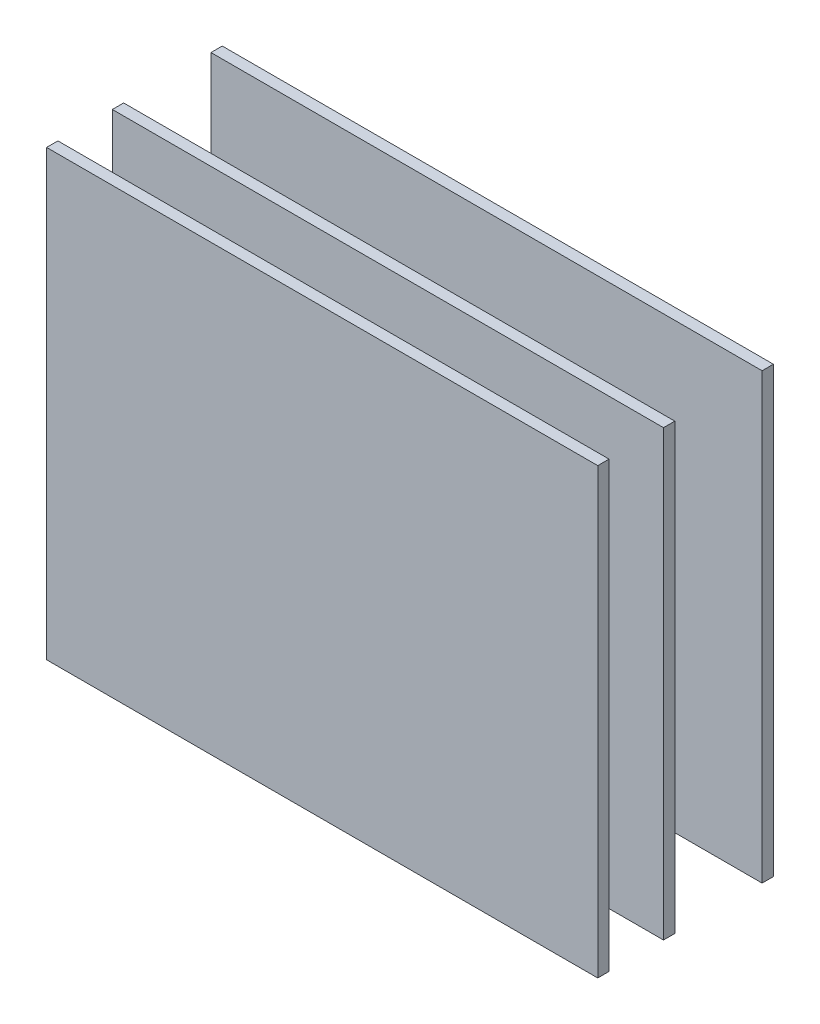
ISO-10303-21;
HEADER;
FILE_DESCRIPTION(('STEP AP214'),'2;1');
FILE_NAME('part.step','',(''),(''),'','','');
FILE_SCHEMA(('AUTOMOTIVE_DESIGN { 1 0 10303 214 1 1 1 1 }'));
ENDSEC;
DATA;
#1=APPLICATION_CONTEXT('core data for automotive mechanical design processes');
#2=APPLICATION_PROTOCOL_DEFINITION('international standard','automotive_design',2000,#1);
#3=PRODUCT_CONTEXT('',#1,'mechanical');
#4=PRODUCT('Part','Part','',(#3));
#5=PRODUCT_RELATED_PRODUCT_CATEGORY('part','',(#4));
#6=PRODUCT_DEFINITION_FORMATION('','',#4);
#7=PRODUCT_DEFINITION_CONTEXT('part definition',#1,'design');
#8=PRODUCT_DEFINITION('design','',#6,#7);
#9=PRODUCT_DEFINITION_SHAPE('','',#8);
#10=(LENGTH_UNIT() NAMED_UNIT(*) SI_UNIT(.MILLI.,.METRE.));
#11=(NAMED_UNIT(*) PLANE_ANGLE_UNIT() SI_UNIT($,.RADIAN.));
#12=(NAMED_UNIT(*) SI_UNIT($,.STERADIAN.) SOLID_ANGLE_UNIT());
#13=UNCERTAINTY_MEASURE_WITH_UNIT(LENGTH_MEASURE(1.E-05),#10,'distance_accuracy_value','');
#14=(GEOMETRIC_REPRESENTATION_CONTEXT(3) GLOBAL_UNCERTAINTY_ASSIGNED_CONTEXT((#13)) GLOBAL_UNIT_ASSIGNED_CONTEXT((#10,
#11,#12)) REPRESENTATION_CONTEXT('',''));
#15=CARTESIAN_POINT('',(0.,0.,0.));
#16=DIRECTION('',(0.,0.,1.));
#17=DIRECTION('',(1.,0.,0.));
#18=AXIS2_PLACEMENT_3D('',#15,#16,#17);
#19=CARTESIAN_POINT('',(0.838391795984,0.675,0.607810488195));
#20=DIRECTION('',(0.,0.,-1.));
#21=DIRECTION('',(-1.,0.,0.));
#22=AXIS2_PLACEMENT_3D('',#19,#20,#21);
#23=PLANE('',#22);
#24=DIRECTION('',(1.,0.,0.));
#25=VECTOR('',#24,1.);
#26=CARTESIAN_POINT('',(-1.05,-0.675,0.607810488195));
#27=LINE('',#26,#25);
#28=CARTESIAN_POINT('',(-0.838391795984,-0.675,0.607810488195));
#29=VERTEX_POINT('',#28);
#30=CARTESIAN_POINT('',(0.838391795984,-0.675,0.607810488195));
#31=VERTEX_POINT('',#30);
#32=EDGE_CURVE('P0_E68',#29,#31,#27,.T.);
#33=ORIENTED_EDGE('',*,*,#32,.F.);
#34=DIRECTION('',(0.,1.,0.));
#35=VECTOR('',#34,1.);
#36=CARTESIAN_POINT('',(-0.838391795984,0.675,0.607810488195));
#37=LINE('',#36,#35);
#38=CARTESIAN_POINT('',(-0.838391795984,0.675,0.607810488195));
#39=VERTEX_POINT('',#38);
#40=EDGE_CURVE('P0_E55',#39,#29,#37,.F.);
#41=ORIENTED_EDGE('',*,*,#40,.F.);
#42=DIRECTION('',(1.,0.,0.));
#43=VECTOR('',#42,1.);
#44=CARTESIAN_POINT('',(1.05,0.675,0.607810488195));
#45=LINE('',#44,#43);
#46=CARTESIAN_POINT('',(0.838391795984,0.675,0.607810488195));
#47=VERTEX_POINT('',#46);
#48=EDGE_CURVE('P0_E20',#47,#39,#45,.F.);
#49=ORIENTED_EDGE('',*,*,#48,.F.);
#50=DIRECTION('',(0.,1.,0.));
#51=VECTOR('',#50,1.);
#52=CARTESIAN_POINT('',(0.838391795984,0.675,0.607810488195));
#53=LINE('',#52,#51);
#54=EDGE_CURVE('P0_E81',#31,#47,#53,.T.);
#55=ORIENTED_EDGE('',*,*,#54,.F.);
#56=EDGE_LOOP('',(#33,#41,#49,#55));
#57=FACE_BOUND('',#56,.T.);
#58=ADVANCED_FACE('P0_F17',(#57),#23,.T.);
#59=CARTESIAN_POINT('',(1.05,0.675,0.));
#60=DIRECTION('',(0.,1.,0.));
#61=DIRECTION('',(0.,0.,1.));
#62=AXIS2_PLACEMENT_3D('',#59,#60,#61);
#63=PLANE('',#62);
#64=DIRECTION('',(0.,0.,1.));
#65=VECTOR('',#64,1.);
#66=CARTESIAN_POINT('',(-0.838391795984,0.675,0.607810488195));
#67=LINE('',#66,#65);
#68=CARTESIAN_POINT('',(-0.838391795984,0.675,0.642189511805));
#69=VERTEX_POINT('',#68);
#70=EDGE_CURVE('P0_E61',#69,#39,#67,.F.);
#71=ORIENTED_EDGE('',*,*,#70,.F.);
#72=DIRECTION('',(1.,0.,0.));
#73=VECTOR('',#72,1.);
#74=CARTESIAN_POINT('',(-0.838391795984,0.675,0.642189511805));
#75=LINE('',#74,#73);
#76=CARTESIAN_POINT('',(0.838391795984,0.675,0.642189511805));
#77=VERTEX_POINT('',#76);
#78=EDGE_CURVE('P0_E83',#77,#69,#75,.F.);
#79=ORIENTED_EDGE('',*,*,#78,.F.);
#80=DIRECTION('',(0.,0.,-1.));
#81=VECTOR('',#80,1.);
#82=CARTESIAN_POINT('',(0.838391795984,0.675,0.642189511805));
#83=LINE('',#82,#81);
#84=EDGE_CURVE('P0_E64',#47,#77,#83,.F.);
#85=ORIENTED_EDGE('',*,*,#84,.F.);
#86=ORIENTED_EDGE('',*,*,#48,.T.);
#87=EDGE_LOOP('',(#71,#79,#85,#86));
#88=FACE_BOUND('',#87,.T.);
#89=ADVANCED_FACE('P0_F60',(#88),#63,.T.);
#90=CARTESIAN_POINT('',(-0.838391795984,0.675,0.607810488195));
#91=DIRECTION('',(-1.,0.,0.));
#92=DIRECTION('',(0.,0.,1.));
#93=AXIS2_PLACEMENT_3D('',#90,#91,#92);
#94=PLANE('',#93);
#95=DIRECTION('',(0.,0.,-1.));
#96=VECTOR('',#95,1.);
#97=CARTESIAN_POINT('',(-0.838391795984,-0.675,0.));
#98=LINE('',#97,#96);
#99=CARTESIAN_POINT('',(-0.838391795984,-0.675,0.642189511805));
#100=VERTEX_POINT('',#99);
#101=EDGE_CURVE('P0_E70',#100,#29,#98,.T.);
#102=ORIENTED_EDGE('',*,*,#101,.F.);
#103=DIRECTION('',(0.,1.,0.));
#104=VECTOR('',#103,1.);
#105=CARTESIAN_POINT('',(-0.838391795984,0.675,0.642189511805));
#106=LINE('',#105,#104);
#107=EDGE_CURVE('P0_E74',#69,#100,#106,.F.);
#108=ORIENTED_EDGE('',*,*,#107,.F.);
#109=ORIENTED_EDGE('',*,*,#70,.T.);
#110=ORIENTED_EDGE('',*,*,#40,.T.);
#111=EDGE_LOOP('',(#102,#108,#109,#110));
#112=FACE_BOUND('',#111,.T.);
#113=ADVANCED_FACE('P0_F72',(#112),#94,.T.);
#114=CARTESIAN_POINT('',(-1.05,-0.675,0.));
#115=DIRECTION('',(0.,-1.,0.));
#116=DIRECTION('',(0.,0.,-1.));
#117=AXIS2_PLACEMENT_3D('',#114,#115,#116);
#118=PLANE('',#117);
#119=ORIENTED_EDGE('',*,*,#101,.T.);
#120=ORIENTED_EDGE('',*,*,#32,.T.);
#121=DIRECTION('',(0.,0.,-1.));
#122=VECTOR('',#121,1.);
#123=CARTESIAN_POINT('',(0.838391795984,-0.675,0.642189511805));
#124=LINE('',#123,#122);
#125=CARTESIAN_POINT('',(0.838391795984,-0.675,0.642189511805));
#126=VERTEX_POINT('',#125);
#127=EDGE_CURVE('P0_E35',#126,#31,#124,.T.);
#128=ORIENTED_EDGE('',*,*,#127,.F.);
#129=DIRECTION('',(1.,0.,0.));
#130=VECTOR('',#129,1.);
#131=CARTESIAN_POINT('',(-0.838391795984,-0.675,0.642189511805));
#132=LINE('',#131,#130);
#133=EDGE_CURVE('P0_E26',#100,#126,#132,.T.);
#134=ORIENTED_EDGE('',*,*,#133,.F.);
#135=EDGE_LOOP('',(#119,#120,#128,#134));
#136=FACE_BOUND('',#135,.T.);
#137=ADVANCED_FACE('P0_F89',(#136),#118,.T.);
#138=CARTESIAN_POINT('',(0.838391795984,0.675,0.642189511805));
#139=DIRECTION('',(1.,0.,0.));
#140=DIRECTION('',(0.,0.,-1.));
#141=AXIS2_PLACEMENT_3D('',#138,#139,#140);
#142=PLANE('',#141);
#143=ORIENTED_EDGE('',*,*,#127,.T.);
#144=ORIENTED_EDGE('',*,*,#54,.T.);
#145=ORIENTED_EDGE('',*,*,#84,.T.);
#146=DIRECTION('',(0.,1.,0.));
#147=VECTOR('',#146,1.);
#148=CARTESIAN_POINT('',(0.838391795984,0.675,0.642189511805));
#149=LINE('',#148,#147);
#150=EDGE_CURVE('P0_E11',#126,#77,#149,.T.);
#151=ORIENTED_EDGE('',*,*,#150,.F.);
#152=EDGE_LOOP('',(#143,#144,#145,#151));
#153=FACE_BOUND('',#152,.T.);
#154=ADVANCED_FACE('P0_F91',(#153),#142,.T.);
#155=CARTESIAN_POINT('',(-0.838391795984,0.675,0.642189511805));
#156=DIRECTION('',(0.,0.,1.));
#157=DIRECTION('',(1.,0.,0.));
#158=AXIS2_PLACEMENT_3D('',#155,#156,#157);
#159=PLANE('',#158);
#160=ORIENTED_EDGE('',*,*,#133,.T.);
#161=ORIENTED_EDGE('',*,*,#150,.T.);
#162=ORIENTED_EDGE('',*,*,#78,.T.);
#163=ORIENTED_EDGE('',*,*,#107,.T.);
#164=EDGE_LOOP('',(#160,#161,#162,#163));
#165=FACE_BOUND('',#164,.T.);
#166=ADVANCED_FACE('P0_F88',(#165),#159,.T.);
#167=CLOSED_SHELL('',(#58,#89,#113,#137,#154,#166));
#168=MANIFOLD_SOLID_BREP('P0_B1',#167);
#169=CARTESIAN_POINT('',(-0.838391795984,0.675,0.342189511805));
#170=DIRECTION('',(0.,0.,1.));
#171=DIRECTION('',(1.,0.,0.));
#172=AXIS2_PLACEMENT_3D('',#169,#170,#171);
#173=PLANE('',#172);
#174=DIRECTION('',(1.,0.,0.));
#175=VECTOR('',#174,1.);
#176=CARTESIAN_POINT('',(-1.05,-0.675,0.342189511805));
#177=LINE('',#176,#175);
#178=CARTESIAN_POINT('',(0.838391795984,-0.675,0.342189511805));
#179=VERTEX_POINT('',#178);
#180=CARTESIAN_POINT('',(-0.838391795984,-0.675,0.342189511805));
#181=VERTEX_POINT('',#180);
#182=EDGE_CURVE('P1_E68',#179,#181,#177,.F.);
#183=ORIENTED_EDGE('',*,*,#182,.F.);
#184=DIRECTION('',(0.,1.,0.));
#185=VECTOR('',#184,1.);
#186=CARTESIAN_POINT('',(0.838391795984,0.675,0.342189511805));
#187=LINE('',#186,#185);
#188=CARTESIAN_POINT('',(0.838391795984,0.675,0.342189511805));
#189=VERTEX_POINT('',#188);
#190=EDGE_CURVE('P1_E55',#189,#179,#187,.F.);
#191=ORIENTED_EDGE('',*,*,#190,.F.);
#192=DIRECTION('',(1.,0.,0.));
#193=VECTOR('',#192,1.);
#194=CARTESIAN_POINT('',(1.05,0.675,0.342189511805));
#195=LINE('',#194,#193);
#196=CARTESIAN_POINT('',(-0.838391795984,0.675,0.342189511805));
#197=VERTEX_POINT('',#196);
#198=EDGE_CURVE('P1_E20',#197,#189,#195,.T.);
#199=ORIENTED_EDGE('',*,*,#198,.F.);
#200=DIRECTION('',(0.,1.,0.));
#201=VECTOR('',#200,1.);
#202=CARTESIAN_POINT('',(-0.838391795984,0.675,0.342189511805));
#203=LINE('',#202,#201);
#204=EDGE_CURVE('P1_E81',#181,#197,#203,.T.);
#205=ORIENTED_EDGE('',*,*,#204,.F.);
#206=EDGE_LOOP('',(#183,#191,#199,#205));
#207=FACE_BOUND('',#206,.T.);
#208=ADVANCED_FACE('P1_F17',(#207),#173,.T.);
#209=CARTESIAN_POINT('',(1.05,0.675,0.));
#210=DIRECTION('',(0.,1.,0.));
#211=DIRECTION('',(0.,0.,1.));
#212=AXIS2_PLACEMENT_3D('',#209,#210,#211);
#213=PLANE('',#212);
#214=DIRECTION('',(0.,0.,1.));
#215=VECTOR('',#214,1.);
#216=CARTESIAN_POINT('',(-0.838391795984,0.675,0.307810488195));
#217=LINE('',#216,#215);
#218=CARTESIAN_POINT('',(-0.838391795984,0.675,0.307810488195));
#219=VERTEX_POINT('',#218);
#220=EDGE_CURVE('P1_E64',#197,#219,#217,.F.);
#221=ORIENTED_EDGE('',*,*,#220,.F.);
#222=ORIENTED_EDGE('',*,*,#198,.T.);
#223=DIRECTION('',(0.,0.,-1.));
#224=VECTOR('',#223,1.);
#225=CARTESIAN_POINT('',(0.838391795984,0.675,0.342189511805));
#226=LINE('',#225,#224);
#227=CARTESIAN_POINT('',(0.838391795984,0.675,0.307810488195));
#228=VERTEX_POINT('',#227);
#229=EDGE_CURVE('P1_E61',#228,#189,#226,.F.);
#230=ORIENTED_EDGE('',*,*,#229,.F.);
#231=DIRECTION('',(-1.,0.,0.));
#232=VECTOR('',#231,1.);
#233=CARTESIAN_POINT('',(0.838391795984,0.675,0.307810488195));
#234=LINE('',#233,#232);
#235=EDGE_CURVE('P1_E83',#219,#228,#234,.F.);
#236=ORIENTED_EDGE('',*,*,#235,.F.);
#237=EDGE_LOOP('',(#221,#222,#230,#236));
#238=FACE_BOUND('',#237,.T.);
#239=ADVANCED_FACE('P1_F60',(#238),#213,.T.);
#240=CARTESIAN_POINT('',(0.838391795984,0.675,0.342189511805));
#241=DIRECTION('',(1.,0.,0.));
#242=DIRECTION('',(0.,0.,-1.));
#243=AXIS2_PLACEMENT_3D('',#240,#241,#242);
#244=PLANE('',#243);
#245=DIRECTION('',(0.,0.,-1.));
#246=VECTOR('',#245,1.);
#247=CARTESIAN_POINT('',(0.838391795984,-0.675,0.));
#248=LINE('',#247,#246);
#249=CARTESIAN_POINT('',(0.838391795984,-0.675,0.307810488195));
#250=VERTEX_POINT('',#249);
#251=EDGE_CURVE('P1_E70',#250,#179,#248,.F.);
#252=ORIENTED_EDGE('',*,*,#251,.F.);
#253=DIRECTION('',(0.,1.,0.));
#254=VECTOR('',#253,1.);
#255=CARTESIAN_POINT('',(0.838391795984,0.675,0.307810488195));
#256=LINE('',#255,#254);
#257=EDGE_CURVE('P1_E74',#228,#250,#256,.F.);
#258=ORIENTED_EDGE('',*,*,#257,.F.);
#259=ORIENTED_EDGE('',*,*,#229,.T.);
#260=ORIENTED_EDGE('',*,*,#190,.T.);
#261=EDGE_LOOP('',(#252,#258,#259,#260));
#262=FACE_BOUND('',#261,.T.);
#263=ADVANCED_FACE('P1_F72',(#262),#244,.T.);
#264=CARTESIAN_POINT('',(-1.05,-0.675,0.));
#265=DIRECTION('',(0.,-1.,0.));
#266=DIRECTION('',(0.,0.,-1.));
#267=AXIS2_PLACEMENT_3D('',#264,#265,#266);
#268=PLANE('',#267);
#269=DIRECTION('',(0.,0.,1.));
#270=VECTOR('',#269,1.);
#271=CARTESIAN_POINT('',(-0.838391795984,-0.675,0.307810488195));
#272=LINE('',#271,#270);
#273=CARTESIAN_POINT('',(-0.838391795984,-0.675,0.307810488195));
#274=VERTEX_POINT('',#273);
#275=EDGE_CURVE('P1_E35',#274,#181,#272,.T.);
#276=ORIENTED_EDGE('',*,*,#275,.F.);
#277=DIRECTION('',(-1.,0.,0.));
#278=VECTOR('',#277,1.);
#279=CARTESIAN_POINT('',(0.838391795984,-0.675,0.307810488195));
#280=LINE('',#279,#278);
#281=EDGE_CURVE('P1_E26',#250,#274,#280,.T.);
#282=ORIENTED_EDGE('',*,*,#281,.F.);
#283=ORIENTED_EDGE('',*,*,#251,.T.);
#284=ORIENTED_EDGE('',*,*,#182,.T.);
#285=EDGE_LOOP('',(#276,#282,#283,#284));
#286=FACE_BOUND('',#285,.T.);
#287=ADVANCED_FACE('P1_F89',(#286),#268,.T.);
#288=CARTESIAN_POINT('',(-0.838391795984,0.675,0.307810488195));
#289=DIRECTION('',(-1.,0.,0.));
#290=DIRECTION('',(0.,0.,1.));
#291=AXIS2_PLACEMENT_3D('',#288,#289,#290);
#292=PLANE('',#291);
#293=ORIENTED_EDGE('',*,*,#275,.T.);
#294=ORIENTED_EDGE('',*,*,#204,.T.);
#295=ORIENTED_EDGE('',*,*,#220,.T.);
#296=DIRECTION('',(0.,1.,0.));
#297=VECTOR('',#296,1.);
#298=CARTESIAN_POINT('',(-0.838391795984,0.675,0.307810488195));
#299=LINE('',#298,#297);
#300=EDGE_CURVE('P1_E11',#274,#219,#299,.T.);
#301=ORIENTED_EDGE('',*,*,#300,.F.);
#302=EDGE_LOOP('',(#293,#294,#295,#301));
#303=FACE_BOUND('',#302,.T.);
#304=ADVANCED_FACE('P1_F91',(#303),#292,.T.);
#305=CARTESIAN_POINT('',(0.838391795984,0.675,0.307810488195));
#306=DIRECTION('',(0.,0.,-1.));
#307=DIRECTION('',(-1.,0.,0.));
#308=AXIS2_PLACEMENT_3D('',#305,#306,#307);
#309=PLANE('',#308);
#310=ORIENTED_EDGE('',*,*,#281,.T.);
#311=ORIENTED_EDGE('',*,*,#300,.T.);
#312=ORIENTED_EDGE('',*,*,#235,.T.);
#313=ORIENTED_EDGE('',*,*,#257,.T.);
#314=EDGE_LOOP('',(#310,#311,#312,#313));
#315=FACE_BOUND('',#314,.T.);
#316=ADVANCED_FACE('P1_F88',(#315),#309,.T.);
#317=CLOSED_SHELL('',(#208,#239,#263,#287,#304,#316));
#318=MANIFOLD_SOLID_BREP('P1_B1',#317);
#319=CARTESIAN_POINT('',(-0.838391795984,0.675,0.842189511805));
#320=DIRECTION('',(0.,0.,1.));
#321=DIRECTION('',(1.,0.,0.));
#322=AXIS2_PLACEMENT_3D('',#319,#320,#321);
#323=PLANE('',#322);
#324=DIRECTION('',(1.,0.,0.));
#325=VECTOR('',#324,1.);
#326=CARTESIAN_POINT('',(-1.05,-0.675,0.842189511805));
#327=LINE('',#326,#325);
#328=CARTESIAN_POINT('',(0.838391795984,-0.675,0.842189511805));
#329=VERTEX_POINT('',#328);
#330=CARTESIAN_POINT('',(-0.838391795984,-0.675,0.842189511805));
#331=VERTEX_POINT('',#330);
#332=EDGE_CURVE('P2_E68',#329,#331,#327,.F.);
#333=ORIENTED_EDGE('',*,*,#332,.F.);
#334=DIRECTION('',(0.,1.,0.));
#335=VECTOR('',#334,1.);
#336=CARTESIAN_POINT('',(0.838391795984,0.675,0.842189511805));
#337=LINE('',#336,#335);
#338=CARTESIAN_POINT('',(0.838391795984,0.675,0.842189511805));
#339=VERTEX_POINT('',#338);
#340=EDGE_CURVE('P2_E55',#339,#329,#337,.F.);
#341=ORIENTED_EDGE('',*,*,#340,.F.);
#342=DIRECTION('',(1.,0.,0.));
#343=VECTOR('',#342,1.);
#344=CARTESIAN_POINT('',(1.05,0.675,0.842189511805));
#345=LINE('',#344,#343);
#346=CARTESIAN_POINT('',(-0.838391795984,0.675,0.842189511805));
#347=VERTEX_POINT('',#346);
#348=EDGE_CURVE('P2_E20',#347,#339,#345,.T.);
#349=ORIENTED_EDGE('',*,*,#348,.F.);
#350=DIRECTION('',(0.,1.,0.));
#351=VECTOR('',#350,1.);
#352=CARTESIAN_POINT('',(-0.838391795984,0.675,0.842189511805));
#353=LINE('',#352,#351);
#354=EDGE_CURVE('P2_E81',#331,#347,#353,.T.);
#355=ORIENTED_EDGE('',*,*,#354,.F.);
#356=EDGE_LOOP('',(#333,#341,#349,#355));
#357=FACE_BOUND('',#356,.T.);
#358=ADVANCED_FACE('P2_F17',(#357),#323,.T.);
#359=CARTESIAN_POINT('',(1.05,0.675,-0.1));
#360=DIRECTION('',(0.,1.,0.));
#361=DIRECTION('',(0.,0.,1.));
#362=AXIS2_PLACEMENT_3D('',#359,#360,#361);
#363=PLANE('',#362);
#364=DIRECTION('',(0.,0.,1.));
#365=VECTOR('',#364,1.);
#366=CARTESIAN_POINT('',(-0.838391795984,0.675,0.807810488195));
#367=LINE('',#366,#365);
#368=CARTESIAN_POINT('',(-0.838391795984,0.675,0.807810488195));
#369=VERTEX_POINT('',#368);
#370=EDGE_CURVE('P2_E64',#347,#369,#367,.F.);
#371=ORIENTED_EDGE('',*,*,#370,.F.);
#372=ORIENTED_EDGE('',*,*,#348,.T.);
#373=DIRECTION('',(0.,0.,-1.));
#374=VECTOR('',#373,1.);
#375=CARTESIAN_POINT('',(0.838391795984,0.675,0.842189511805));
#376=LINE('',#375,#374);
#377=CARTESIAN_POINT('',(0.838391795984,0.675,0.807810488195));
#378=VERTEX_POINT('',#377);
#379=EDGE_CURVE('P2_E61',#378,#339,#376,.F.);
#380=ORIENTED_EDGE('',*,*,#379,.F.);
#381=DIRECTION('',(-1.,0.,0.));
#382=VECTOR('',#381,1.);
#383=CARTESIAN_POINT('',(0.838391795984,0.675,0.807810488195));
#384=LINE('',#383,#382);
#385=EDGE_CURVE('P2_E83',#369,#378,#384,.F.);
#386=ORIENTED_EDGE('',*,*,#385,.F.);
#387=EDGE_LOOP('',(#371,#372,#380,#386));
#388=FACE_BOUND('',#387,.T.);
#389=ADVANCED_FACE('P2_F60',(#388),#363,.T.);
#390=CARTESIAN_POINT('',(0.838391795984,0.675,0.842189511805));
#391=DIRECTION('',(1.,0.,0.));
#392=DIRECTION('',(0.,0.,-1.));
#393=AXIS2_PLACEMENT_3D('',#390,#391,#392);
#394=PLANE('',#393);
#395=DIRECTION('',(0.,0.,-1.));
#396=VECTOR('',#395,1.);
#397=CARTESIAN_POINT('',(0.838391795984,-0.675,-0.1));
#398=LINE('',#397,#396);
#399=CARTESIAN_POINT('',(0.838391795984,-0.675,0.807810488195));
#400=VERTEX_POINT('',#399);
#401=EDGE_CURVE('P2_E70',#400,#329,#398,.F.);
#402=ORIENTED_EDGE('',*,*,#401,.F.);
#403=DIRECTION('',(0.,1.,0.));
#404=VECTOR('',#403,1.);
#405=CARTESIAN_POINT('',(0.838391795984,0.675,0.807810488195));
#406=LINE('',#405,#404);
#407=EDGE_CURVE('P2_E74',#378,#400,#406,.F.);
#408=ORIENTED_EDGE('',*,*,#407,.F.);
#409=ORIENTED_EDGE('',*,*,#379,.T.);
#410=ORIENTED_EDGE('',*,*,#340,.T.);
#411=EDGE_LOOP('',(#402,#408,#409,#410));
#412=FACE_BOUND('',#411,.T.);
#413=ADVANCED_FACE('P2_F72',(#412),#394,.T.);
#414=CARTESIAN_POINT('',(-1.05,-0.675,-0.1));
#415=DIRECTION('',(0.,-1.,0.));
#416=DIRECTION('',(0.,0.,-1.));
#417=AXIS2_PLACEMENT_3D('',#414,#415,#416);
#418=PLANE('',#417);
#419=DIRECTION('',(0.,0.,1.));
#420=VECTOR('',#419,1.);
#421=CARTESIAN_POINT('',(-0.838391795984,-0.675,0.807810488195));
#422=LINE('',#421,#420);
#423=CARTESIAN_POINT('',(-0.838391795984,-0.675,0.807810488195));
#424=VERTEX_POINT('',#423);
#425=EDGE_CURVE('P2_E35',#424,#331,#422,.T.);
#426=ORIENTED_EDGE('',*,*,#425,.F.);
#427=DIRECTION('',(-1.,0.,0.));
#428=VECTOR('',#427,1.);
#429=CARTESIAN_POINT('',(0.838391795984,-0.675,0.807810488195));
#430=LINE('',#429,#428);
#431=EDGE_CURVE('P2_E26',#400,#424,#430,.T.);
#432=ORIENTED_EDGE('',*,*,#431,.F.);
#433=ORIENTED_EDGE('',*,*,#401,.T.);
#434=ORIENTED_EDGE('',*,*,#332,.T.);
#435=EDGE_LOOP('',(#426,#432,#433,#434));
#436=FACE_BOUND('',#435,.T.);
#437=ADVANCED_FACE('P2_F89',(#436),#418,.T.);
#438=CARTESIAN_POINT('',(-0.838391795984,0.675,0.807810488195));
#439=DIRECTION('',(-1.,0.,0.));
#440=DIRECTION('',(0.,0.,1.));
#441=AXIS2_PLACEMENT_3D('',#438,#439,#440);
#442=PLANE('',#441);
#443=ORIENTED_EDGE('',*,*,#425,.T.);
#444=ORIENTED_EDGE('',*,*,#354,.T.);
#445=ORIENTED_EDGE('',*,*,#370,.T.);
#446=DIRECTION('',(0.,1.,0.));
#447=VECTOR('',#446,1.);
#448=CARTESIAN_POINT('',(-0.838391795984,0.675,0.807810488195));
#449=LINE('',#448,#447);
#450=EDGE_CURVE('P2_E11',#424,#369,#449,.T.);
#451=ORIENTED_EDGE('',*,*,#450,.F.);
#452=EDGE_LOOP('',(#443,#444,#445,#451));
#453=FACE_BOUND('',#452,.T.);
#454=ADVANCED_FACE('P2_F91',(#453),#442,.T.);
#455=CARTESIAN_POINT('',(0.838391795984,0.675,0.807810488195));
#456=DIRECTION('',(0.,0.,-1.));
#457=DIRECTION('',(-1.,0.,0.));
#458=AXIS2_PLACEMENT_3D('',#455,#456,#457);
#459=PLANE('',#458);
#460=ORIENTED_EDGE('',*,*,#431,.T.);
#461=ORIENTED_EDGE('',*,*,#450,.T.);
#462=ORIENTED_EDGE('',*,*,#385,.T.);
#463=ORIENTED_EDGE('',*,*,#407,.T.);
#464=EDGE_LOOP('',(#460,#461,#462,#463));
#465=FACE_BOUND('',#464,.T.);
#466=ADVANCED_FACE('P2_F88',(#465),#459,.T.);
#467=CLOSED_SHELL('',(#358,#389,#413,#437,#454,#466));
#468=MANIFOLD_SOLID_BREP('P2_B1',#467);
#469=ADVANCED_BREP_SHAPE_REPRESENTATION('',(#18,#168,#318,#468),#14);
#470=SHAPE_DEFINITION_REPRESENTATION(#9,#469);
ENDSEC;
END-ISO-10303-21;
